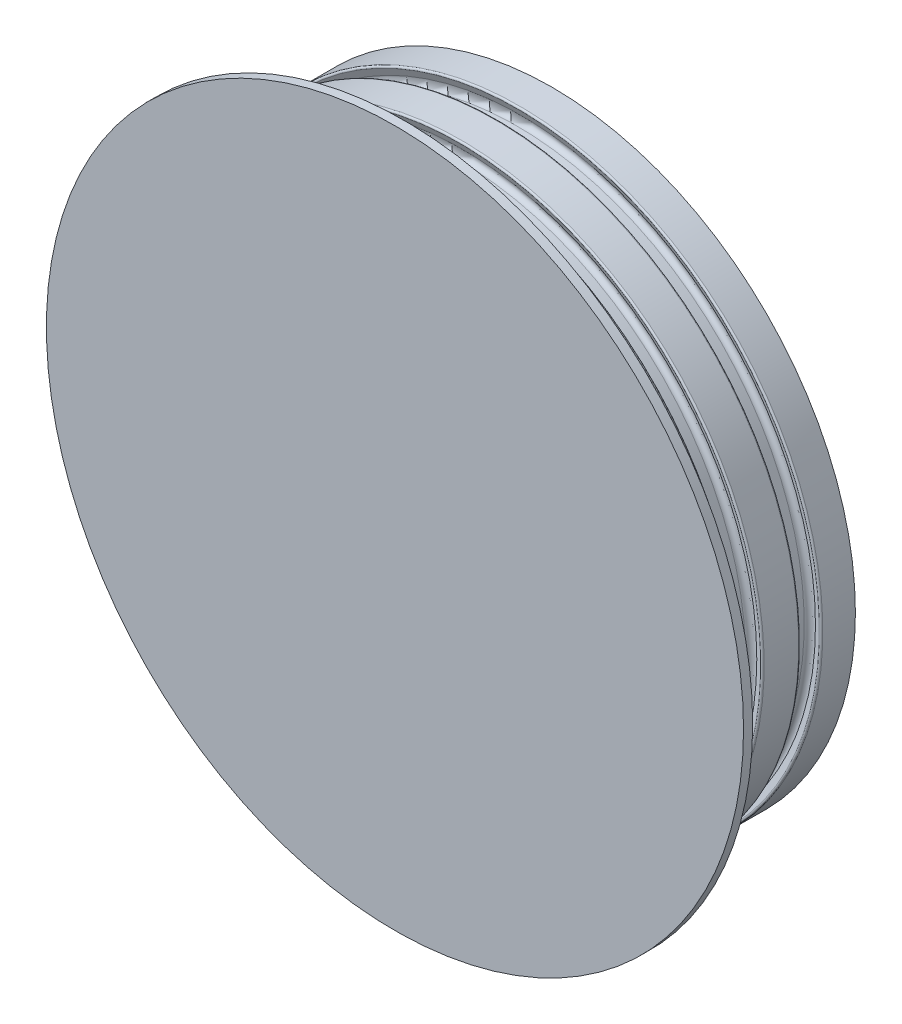
ISO-10303-21;
HEADER;
FILE_DESCRIPTION(('STEP AP214'),'2;1');
FILE_NAME('part.step','',(''),(''),'','','');
FILE_SCHEMA(('AUTOMOTIVE_DESIGN { 1 0 10303 214 1 1 1 1 }'));
ENDSEC;
DATA;
#1=APPLICATION_CONTEXT('core data for automotive mechanical design processes');
#2=APPLICATION_PROTOCOL_DEFINITION('international standard','automotive_design',2000,#1);
#3=PRODUCT_CONTEXT('',#1,'mechanical');
#4=PRODUCT('Part','Part','',(#3));
#5=PRODUCT_RELATED_PRODUCT_CATEGORY('part','',(#4));
#6=PRODUCT_DEFINITION_FORMATION('','',#4);
#7=PRODUCT_DEFINITION_CONTEXT('part definition',#1,'design');
#8=PRODUCT_DEFINITION('design','',#6,#7);
#9=PRODUCT_DEFINITION_SHAPE('','',#8);
#10=(LENGTH_UNIT() NAMED_UNIT(*) SI_UNIT(.MILLI.,.METRE.));
#11=(NAMED_UNIT(*) PLANE_ANGLE_UNIT() SI_UNIT($,.RADIAN.));
#12=(NAMED_UNIT(*) SI_UNIT($,.STERADIAN.) SOLID_ANGLE_UNIT());
#13=UNCERTAINTY_MEASURE_WITH_UNIT(LENGTH_MEASURE(1.E-05),#10,'distance_accuracy_value','');
#14=(GEOMETRIC_REPRESENTATION_CONTEXT(3) GLOBAL_UNCERTAINTY_ASSIGNED_CONTEXT((#13)) GLOBAL_UNIT_ASSIGNED_CONTEXT((#10,
#11,#12)) REPRESENTATION_CONTEXT('',''));
#15=CARTESIAN_POINT('',(0.,0.,0.));
#16=DIRECTION('',(0.,0.,1.));
#17=DIRECTION('',(1.,0.,0.));
#18=AXIS2_PLACEMENT_3D('',#15,#16,#17);
#19=CARTESIAN_POINT('',(0.,0.,77.1738238691624));
#20=DIRECTION('',(0.,0.,-1.));
#21=DIRECTION('',(-1.,0.,0.));
#22=AXIS2_PLACEMENT_3D('',#19,#20,#21);
#23=CYLINDRICAL_SURFACE('',#22,23.);
#24=CARTESIAN_POINT('',(0.,0.,0.));
#25=DIRECTION('',(0.,0.,-1.));
#26=DIRECTION('',(-1.,0.,0.));
#27=AXIS2_PLACEMENT_3D('',#24,#25,#26);
#28=CIRCLE('',#27,23.);
#29=CARTESIAN_POINT('',(-23.,0.,0.));
#30=VERTEX_POINT('',#29);
#31=EDGE_CURVE('E288',#30,#30,#28,.T.);
#32=ORIENTED_EDGE('',*,*,#31,.T.);
#33=EDGE_LOOP('',(#32));
#34=FACE_BOUND('',#33,.T.);
#35=DIRECTION('',(0.,0.,1.));
#36=VECTOR('',#35,1.);
#37=CARTESIAN_POINT('',(22.8992903820184,2.15,6.08887112585072));
#38=LINE('',#37,#36);
#39=CARTESIAN_POINT('',(22.8992903820184,2.15,10.12));
#40=VERTEX_POINT('',#39);
#41=CARTESIAN_POINT('',(22.8992903820184,2.15,12.12));
#42=VERTEX_POINT('',#41);
#43=EDGE_CURVE('E51',#40,#42,#38,.T.);
#44=ORIENTED_EDGE('',*,*,#43,.F.);
#45=CARTESIAN_POINT('',(0.,0.,10.12));
#46=DIRECTION('',(0.,0.,1.));
#47=DIRECTION('',(1.,0.,0.));
#48=AXIS2_PLACEMENT_3D('',#45,#46,#47);
#49=CIRCLE('',#48,23.);
#50=CARTESIAN_POINT('',(22.6224998618632,4.15,10.12));
#51=VERTEX_POINT('',#50);
#52=EDGE_CURVE('E55',#40,#51,#49,.T.);
#53=ORIENTED_EDGE('',*,*,#52,.T.);
#54=DIRECTION('',(0.,0.,1.));
#55=VECTOR('',#54,1.);
#56=CARTESIAN_POINT('',(22.6224998618632,4.15,6.08887112585072));
#57=LINE('',#56,#55);
#58=CARTESIAN_POINT('',(22.6224998618632,4.15,12.12));
#59=VERTEX_POINT('',#58);
#60=EDGE_CURVE('E174',#51,#59,#57,.T.);
#61=ORIENTED_EDGE('',*,*,#60,.T.);
#62=CARTESIAN_POINT('',(0.,0.,12.12));
#63=DIRECTION('',(0.,0.,1.));
#64=DIRECTION('',(1.,0.,0.));
#65=AXIS2_PLACEMENT_3D('',#62,#63,#64);
#66=CIRCLE('',#65,23.);
#67=CARTESIAN_POINT('',(21.9089023002066,6.99999999999999,12.12));
#68=VERTEX_POINT('',#67);
#69=EDGE_CURVE('E161',#68,#59,#66,.F.);
#70=ORIENTED_EDGE('',*,*,#69,.F.);
#71=DIRECTION('',(0.,0.,-1.));
#72=VECTOR('',#71,1.);
#73=CARTESIAN_POINT('',(21.9089023002066,6.99999999999999,34.9954850436765));
#74=LINE('',#73,#72);
#75=CARTESIAN_POINT('',(21.9089023002066,6.99999999999999,10.12));
#76=VERTEX_POINT('',#75);
#77=EDGE_CURVE('E284',#68,#76,#74,.T.);
#78=ORIENTED_EDGE('',*,*,#77,.T.);
#79=CARTESIAN_POINT('',(0.,0.,10.12));
#80=DIRECTION('',(0.,0.,1.));
#81=DIRECTION('',(1.,0.,0.));
#82=AXIS2_PLACEMENT_3D('',#79,#80,#81);
#83=CIRCLE('',#82,23.);
#84=CARTESIAN_POINT('',(21.9089023002066,-7.,10.12));
#85=VERTEX_POINT('',#84);
#86=EDGE_CURVE('E297',#85,#76,#83,.F.);
#87=ORIENTED_EDGE('',*,*,#86,.F.);
#88=DIRECTION('',(0.,0.,-1.));
#89=VECTOR('',#88,1.);
#90=CARTESIAN_POINT('',(21.9089023002066,-7.,34.9954850436765));
#91=LINE('',#90,#89);
#92=CARTESIAN_POINT('',(21.9089023002066,-7.,12.12));
#93=VERTEX_POINT('',#92);
#94=EDGE_CURVE('E289',#93,#85,#91,.T.);
#95=ORIENTED_EDGE('',*,*,#94,.F.);
#96=CARTESIAN_POINT('',(22.6224998618632,-4.15,12.12));
#97=VERTEX_POINT('',#96);
#98=EDGE_CURVE('E292',#97,#93,#66,.F.);
#99=ORIENTED_EDGE('',*,*,#98,.F.);
#100=DIRECTION('',(0.,0.,1.));
#101=VECTOR('',#100,1.);
#102=CARTESIAN_POINT('',(22.6224998618632,-4.15,6.08887112585072));
#103=LINE('',#102,#101);
#104=CARTESIAN_POINT('',(22.6224998618632,-4.15,10.12));
#105=VERTEX_POINT('',#104);
#106=EDGE_CURVE('E223',#105,#97,#103,.T.);
#107=ORIENTED_EDGE('',*,*,#106,.F.);
#108=CARTESIAN_POINT('',(0.,0.,10.12));
#109=DIRECTION('',(0.,0.,1.));
#110=DIRECTION('',(1.,0.,0.));
#111=AXIS2_PLACEMENT_3D('',#108,#109,#110);
#112=CIRCLE('',#111,23.);
#113=CARTESIAN_POINT('',(22.8992903820184,-2.15,10.12));
#114=VERTEX_POINT('',#113);
#115=EDGE_CURVE('E202',#105,#114,#112,.T.);
#116=ORIENTED_EDGE('',*,*,#115,.T.);
#117=DIRECTION('',(0.,0.,1.));
#118=VECTOR('',#117,1.);
#119=CARTESIAN_POINT('',(22.8992903820184,-2.15,6.08887112585072));
#120=LINE('',#119,#118);
#121=CARTESIAN_POINT('',(22.8992903820184,-2.15,12.12));
#122=VERTEX_POINT('',#121);
#123=EDGE_CURVE('E214',#114,#122,#120,.T.);
#124=ORIENTED_EDGE('',*,*,#123,.T.);
#125=EDGE_CURVE('E291',#42,#122,#66,.F.);
#126=ORIENTED_EDGE('',*,*,#125,.F.);
#127=EDGE_LOOP('',(#44,#53,#61,#70,#78,#87,#95,#99,#107,#116,#124,#126));
#128=FACE_BOUND('',#127,.T.);
#129=ADVANCED_FACE('F36',(#34,#128),#23,.F.);
#130=CARTESIAN_POINT('',(0.,0.,12.12));
#131=DIRECTION('',(0.,0.,1.));
#132=DIRECTION('',(1.,0.,0.));
#133=AXIS2_PLACEMENT_3D('',#130,#131,#132);
#134=PLANE('',#133);
#135=CARTESIAN_POINT('',(13.5814803603831,2.15,12.12));
#136=DIRECTION('',(0.,0.,1.));
#137=DIRECTION('',(1.,0.,0.));
#138=AXIS2_PLACEMENT_3D('',#135,#136,#137);
#139=CIRCLE('',#138,0.75);
#140=CARTESIAN_POINT('',(14.3314803603831,2.15,12.12));
#141=VERTEX_POINT('',#140);
#142=EDGE_CURVE('E12',#141,#141,#139,.F.);
#143=ORIENTED_EDGE('',*,*,#142,.F.);
#144=EDGE_LOOP('',(#143));
#145=FACE_BOUND('',#144,.T.);
#146=CARTESIAN_POINT('',(13.5814803603831,-2.15,12.12));
#147=DIRECTION('',(0.,0.,1.));
#148=DIRECTION('',(1.,0.,0.));
#149=AXIS2_PLACEMENT_3D('',#146,#147,#148);
#150=CIRCLE('',#149,0.75);
#151=CARTESIAN_POINT('',(14.3314803603831,-2.15,12.12));
#152=VERTEX_POINT('',#151);
#153=EDGE_CURVE('E44',#152,#152,#150,.F.);
#154=ORIENTED_EDGE('',*,*,#153,.F.);
#155=EDGE_LOOP('',(#154));
#156=FACE_BOUND('',#155,.T.);
#157=DIRECTION('',(-1.,0.,0.));
#158=VECTOR('',#157,1.);
#159=CARTESIAN_POINT('',(19.3992903820184,2.15,12.12));
#160=LINE('',#159,#158);
#161=CARTESIAN_POINT('',(19.3992903820184,2.15,12.12));
#162=VERTEX_POINT('',#161);
#163=EDGE_CURVE('E164',#42,#162,#160,.T.);
#164=ORIENTED_EDGE('',*,*,#163,.F.);
#165=ORIENTED_EDGE('',*,*,#125,.T.);
#166=DIRECTION('',(1.,0.,0.));
#167=VECTOR('',#166,1.);
#168=CARTESIAN_POINT('',(19.3992903820184,-2.15,12.12));
#169=LINE('',#168,#167);
#170=CARTESIAN_POINT('',(19.3992903820184,-2.15,12.12));
#171=VERTEX_POINT('',#170);
#172=EDGE_CURVE('E211',#171,#122,#169,.T.);
#173=ORIENTED_EDGE('',*,*,#172,.F.);
#174=DIRECTION('',(0.,1.,0.));
#175=VECTOR('',#174,1.);
#176=CARTESIAN_POINT('',(19.3992903820184,-4.15,12.12));
#177=LINE('',#176,#175);
#178=CARTESIAN_POINT('',(19.3992903820184,-4.15,12.12));
#179=VERTEX_POINT('',#178);
#180=EDGE_CURVE('E208',#179,#171,#177,.T.);
#181=ORIENTED_EDGE('',*,*,#180,.F.);
#182=DIRECTION('',(-1.,0.,0.));
#183=VECTOR('',#182,1.);
#184=CARTESIAN_POINT('',(22.6224998618632,-4.15,12.12));
#185=LINE('',#184,#183);
#186=EDGE_CURVE('E205',#97,#179,#185,.T.);
#187=ORIENTED_EDGE('',*,*,#186,.F.);
#188=ORIENTED_EDGE('',*,*,#98,.T.);
#189=DIRECTION('',(-1.,0.,0.));
#190=VECTOR('',#189,1.);
#191=CARTESIAN_POINT('',(21.9089023002066,-7.,12.12));
#192=LINE('',#191,#190);
#193=CARTESIAN_POINT('',(6.55261113046004,-7.,12.12));
#194=VERTEX_POINT('',#193);
#195=EDGE_CURVE('E285',#93,#194,#192,.T.);
#196=ORIENTED_EDGE('',*,*,#195,.T.);
#197=DIRECTION('',(0.,1.,0.));
#198=VECTOR('',#197,1.);
#199=CARTESIAN_POINT('',(6.55261113046003,0.,12.12));
#200=LINE('',#199,#198);
#201=CARTESIAN_POINT('',(6.55261113046004,7.,12.12));
#202=VERTEX_POINT('',#201);
#203=EDGE_CURVE('E362',#194,#202,#200,.T.);
#204=ORIENTED_EDGE('',*,*,#203,.T.);
#205=DIRECTION('',(1.,0.,0.));
#206=VECTOR('',#205,1.);
#207=CARTESIAN_POINT('',(21.9089023002066,7.,12.12));
#208=LINE('',#207,#206);
#209=EDGE_CURVE('E280',#202,#68,#208,.T.);
#210=ORIENTED_EDGE('',*,*,#209,.T.);
#211=ORIENTED_EDGE('',*,*,#69,.T.);
#212=DIRECTION('',(1.,0.,0.));
#213=VECTOR('',#212,1.);
#214=CARTESIAN_POINT('',(22.6224998618632,4.15,12.12));
#215=LINE('',#214,#213);
#216=CARTESIAN_POINT('',(19.3992903820184,4.15,12.12));
#217=VERTEX_POINT('',#216);
#218=EDGE_CURVE('E154',#217,#59,#215,.T.);
#219=ORIENTED_EDGE('',*,*,#218,.F.);
#220=DIRECTION('',(0.,1.,0.));
#221=VECTOR('',#220,1.);
#222=CARTESIAN_POINT('',(19.3992903820184,4.15,12.12));
#223=LINE('',#222,#221);
#224=EDGE_CURVE('E158',#162,#217,#223,.T.);
#225=ORIENTED_EDGE('',*,*,#224,.F.);
#226=EDGE_LOOP('',(#164,#165,#173,#181,#187,#188,#196,#204,#210,#211,#219,#225));
#227=FACE_BOUND('',#226,.T.);
#228=ADVANCED_FACE('F156',(#145,#156,#227),#134,.F.);
#229=CARTESIAN_POINT('',(0.,0.,10.12));
#230=DIRECTION('',(0.,0.,1.));
#231=DIRECTION('',(1.,0.,0.));
#232=AXIS2_PLACEMENT_3D('',#229,#230,#231);
#233=PLANE('',#232);
#234=DIRECTION('',(1.,0.,0.));
#235=VECTOR('',#234,1.);
#236=CARTESIAN_POINT('',(-5.,14.7403760248598,10.12));
#237=LINE('',#236,#235);
#238=CARTESIAN_POINT('',(-15.,14.7403760248598,10.12));
#239=VERTEX_POINT('',#238);
#240=CARTESIAN_POINT('',(-5.,14.7403760248598,10.12));
#241=VERTEX_POINT('',#240);
#242=EDGE_CURVE('E251',#239,#241,#237,.T.);
#243=ORIENTED_EDGE('',*,*,#242,.F.);
#244=DIRECTION('',(0.,1.,0.));
#245=VECTOR('',#244,1.);
#246=CARTESIAN_POINT('',(-15.,14.7403760248598,10.12));
#247=LINE('',#246,#245);
#248=CARTESIAN_POINT('',(-15.,-14.7403760248598,10.12));
#249=VERTEX_POINT('',#248);
#250=EDGE_CURVE('E204',#249,#239,#247,.T.);
#251=ORIENTED_EDGE('',*,*,#250,.F.);
#252=DIRECTION('',(-1.,0.,0.));
#253=VECTOR('',#252,1.);
#254=CARTESIAN_POINT('',(-5.,-14.7403760248598,10.12));
#255=LINE('',#254,#253);
#256=CARTESIAN_POINT('',(-5.,-14.7403760248598,10.12));
#257=VERTEX_POINT('',#256);
#258=EDGE_CURVE('E240',#257,#249,#255,.T.);
#259=ORIENTED_EDGE('',*,*,#258,.F.);
#260=DIRECTION('',(0.,-1.,0.));
#261=VECTOR('',#260,1.);
#262=CARTESIAN_POINT('',(-5.,14.7403760248598,10.12));
#263=LINE('',#262,#261);
#264=EDGE_CURVE('E254',#241,#257,#263,.T.);
#265=ORIENTED_EDGE('',*,*,#264,.F.);
#266=EDGE_LOOP('',(#243,#251,#259,#265));
#267=FACE_BOUND('',#266,.T.);
#268=CARTESIAN_POINT('',(11.6424908306669,-11.,10.12));
#269=DIRECTION('',(0.,0.,-1.));
#270=DIRECTION('',(1.,0.,0.));
#271=AXIS2_PLACEMENT_3D('',#268,#269,#270);
#272=CIRCLE('',#271,2.);
#273=CARTESIAN_POINT('',(13.6424908306669,-11.,10.12));
#274=VERTEX_POINT('',#273);
#275=EDGE_CURVE('E232',#274,#274,#272,.T.);
#276=ORIENTED_EDGE('',*,*,#275,.F.);
#277=EDGE_LOOP('',(#276));
#278=FACE_BOUND('',#277,.T.);
#279=CARTESIAN_POINT('',(11.6424908306669,11.,10.12));
#280=DIRECTION('',(0.,0.,-1.));
#281=DIRECTION('',(-1.,0.,0.));
#282=AXIS2_PLACEMENT_3D('',#279,#280,#281);
#283=CIRCLE('',#282,2.);
#284=CARTESIAN_POINT('',(9.64249083066692,11.,10.12));
#285=VERTEX_POINT('',#284);
#286=EDGE_CURVE('E231',#285,#285,#283,.T.);
#287=ORIENTED_EDGE('',*,*,#286,.F.);
#288=EDGE_LOOP('',(#287));
#289=FACE_BOUND('',#288,.T.);
#290=DIRECTION('',(1.,0.,0.));
#291=VECTOR('',#290,1.);
#292=CARTESIAN_POINT('',(21.9089023002066,7.,10.12));
#293=LINE('',#292,#291);
#294=CARTESIAN_POINT('',(2.08047517546045,7.,10.12));
#295=VERTEX_POINT('',#294);
#296=EDGE_CURVE('E275',#295,#76,#293,.T.);
#297=ORIENTED_EDGE('',*,*,#296,.F.);
#298=DIRECTION('',(0.,1.,0.));
#299=VECTOR('',#298,1.);
#300=CARTESIAN_POINT('',(2.08047517546045,0.,10.12));
#301=LINE('',#300,#299);
#302=CARTESIAN_POINT('',(2.08047517546045,-7.,10.12));
#303=VERTEX_POINT('',#302);
#304=EDGE_CURVE('E352',#295,#303,#301,.F.);
#305=ORIENTED_EDGE('',*,*,#304,.T.);
#306=DIRECTION('',(-1.,0.,0.));
#307=VECTOR('',#306,1.);
#308=CARTESIAN_POINT('',(21.9089023002066,-7.,10.12));
#309=LINE('',#308,#307);
#310=EDGE_CURVE('E278',#85,#303,#309,.T.);
#311=ORIENTED_EDGE('',*,*,#310,.F.);
#312=ORIENTED_EDGE('',*,*,#86,.T.);
#313=EDGE_LOOP('',(#297,#305,#311,#312));
#314=FACE_BOUND('',#313,.T.);
#315=ADVANCED_FACE('F376',(#267,#278,#289,#314),#233,.F.);
#316=CARTESIAN_POINT('',(0.,0.,12.12));
#317=DIRECTION('',(0.,0.,-1.));
#318=DIRECTION('',(-1.,0.,0.));
#319=AXIS2_PLACEMENT_3D('',#316,#317,#318);
#320=CYLINDRICAL_SURFACE('',#319,24.875);
#321=CARTESIAN_POINT('',(0.,0.,0.));
#322=DIRECTION('',(0.,0.,1.));
#323=DIRECTION('',(1.,0.,0.));
#324=AXIS2_PLACEMENT_3D('',#321,#322,#323);
#325=CIRCLE('',#324,24.875);
#326=CARTESIAN_POINT('',(24.875,0.,0.));
#327=VERTEX_POINT('',#326);
#328=EDGE_CURVE('E326',#327,#327,#325,.T.);
#329=ORIENTED_EDGE('',*,*,#328,.T.);
#330=EDGE_LOOP('',(#329));
#331=FACE_BOUND('',#330,.T.);
#332=CARTESIAN_POINT('',(0.,0.,2.668058361891));
#333=DIRECTION('',(0.,0.,-1.));
#334=DIRECTION('',(-1.,0.,0.));
#335=AXIS2_PLACEMENT_3D('',#332,#333,#334);
#336=CIRCLE('',#335,24.875);
#337=CARTESIAN_POINT('',(-24.875,0.,2.668058361891));
#338=VERTEX_POINT('',#337);
#339=EDGE_CURVE('E311',#338,#338,#336,.T.);
#340=ORIENTED_EDGE('',*,*,#339,.T.);
#341=EDGE_LOOP('',(#340));
#342=FACE_BOUND('',#341,.T.);
#343=ADVANCED_FACE('F384',(#331,#342),#320,.T.);
#344=CARTESIAN_POINT('',(0.,0.,0.));
#345=DIRECTION('',(0.,0.,1.));
#346=DIRECTION('',(1.,0.,0.));
#347=AXIS2_PLACEMENT_3D('',#344,#345,#346);
#348=PLANE('',#347);
#349=ORIENTED_EDGE('',*,*,#31,.F.);
#350=EDGE_LOOP('',(#349));
#351=FACE_BOUND('',#350,.T.);
#352=ORIENTED_EDGE('',*,*,#328,.F.);
#353=EDGE_LOOP('',(#352));
#354=FACE_BOUND('',#353,.T.);
#355=ADVANCED_FACE('F450',(#351,#354),#348,.F.);
#356=CARTESIAN_POINT('',(0.,0.,4.41248709063451));
#357=DIRECTION('',(0.,0.,-1.));
#358=DIRECTION('',(-1.,0.,0.));
#359=AXIS2_PLACEMENT_3D('',#356,#357,#358);
#360=TOROIDAL_SURFACE('',#359,23.973935,0.396875000000001);
#361=CARTESIAN_POINT('',(0.,0.,4.77505044413642));
#362=DIRECTION('',(0.,0.,-1.));
#363=DIRECTION('',(-1.,0.,0.));
#364=AXIS2_PLACEMENT_3D('',#361,#362,#363);
#365=CIRCLE('',#364,24.1353586052207);
#366=CARTESIAN_POINT('',(-24.1353586052207,0.,4.77505044413642));
#367=VERTEX_POINT('',#366);
#368=EDGE_CURVE('E301',#367,#367,#365,.T.);
#369=ORIENTED_EDGE('',*,*,#368,.T.);
#370=EDGE_LOOP('',(#369));
#371=FACE_BOUND('',#370,.T.);
#372=CARTESIAN_POINT('',(0.,0.,4.41248709063451));
#373=DIRECTION('',(0.,0.,-1.));
#374=DIRECTION('',(-1.,0.,0.));
#375=AXIS2_PLACEMENT_3D('',#372,#373,#374);
#376=CIRCLE('',#375,23.57706);
#377=CARTESIAN_POINT('',(-23.57706,0.,4.41248709063451));
#378=VERTEX_POINT('',#377);
#379=EDGE_CURVE('E323',#378,#378,#376,.T.);
#380=ORIENTED_EDGE('',*,*,#379,.F.);
#381=EDGE_LOOP('',(#380));
#382=FACE_BOUND('',#381,.T.);
#383=ADVANCED_FACE('F446',(#371,#382),#360,.F.);
#384=CARTESIAN_POINT('',(0.,0.,0.));
#385=DIRECTION('',(0.,0.,-1.));
#386=DIRECTION('',(-1.,0.,0.));
#387=AXIS2_PLACEMENT_3D('',#384,#385,#386);
#388=CYLINDRICAL_SURFACE('',#387,23.57706);
#389=ORIENTED_EDGE('',*,*,#379,.T.);
#390=EDGE_LOOP('',(#389));
#391=FACE_BOUND('',#390,.T.);
#392=CARTESIAN_POINT('',(0.,0.,2.896875));
#393=DIRECTION('',(0.,0.,-1.));
#394=DIRECTION('',(-1.,0.,0.));
#395=AXIS2_PLACEMENT_3D('',#392,#393,#394);
#396=CIRCLE('',#395,23.57706);
#397=CARTESIAN_POINT('',(-23.57706,0.,2.896875));
#398=VERTEX_POINT('',#397);
#399=EDGE_CURVE('E320',#398,#398,#396,.T.);
#400=ORIENTED_EDGE('',*,*,#399,.F.);
#401=EDGE_LOOP('',(#400));
#402=FACE_BOUND('',#401,.T.);
#403=ADVANCED_FACE('F442',(#391,#402),#388,.T.);
#404=CARTESIAN_POINT('',(0.,0.,2.896875));
#405=DIRECTION('',(0.,0.,-1.));
#406=DIRECTION('',(-1.,0.,0.));
#407=AXIS2_PLACEMENT_3D('',#404,#405,#406);
#408=TOROIDAL_SURFACE('',#407,23.973935,0.396875000000001);
#409=ORIENTED_EDGE('',*,*,#399,.T.);
#410=EDGE_LOOP('',(#409));
#411=FACE_BOUND('',#410,.T.);
#412=CARTESIAN_POINT('',(0.,0.,2.5343116464981));
#413=DIRECTION('',(0.,0.,-1.));
#414=DIRECTION('',(-1.,0.,0.));
#415=AXIS2_PLACEMENT_3D('',#412,#413,#414);
#416=CIRCLE('',#415,24.1353586052207);
#417=CARTESIAN_POINT('',(-24.1353586052207,0.,2.5343116464981));
#418=VERTEX_POINT('',#417);
#419=EDGE_CURVE('E317',#418,#418,#416,.T.);
#420=ORIENTED_EDGE('',*,*,#419,.F.);
#421=EDGE_LOOP('',(#420));
#422=FACE_BOUND('',#421,.T.);
#423=ADVANCED_FACE('F438',(#411,#422),#408,.F.);
#424=CARTESIAN_POINT('',(0.,0.,2.78407863501161));
#425=DIRECTION('',(0.,0.,1.));
#426=DIRECTION('',(1.,0.,0.));
#427=AXIS2_PLACEMENT_3D('',#424,#425,#426);
#428=CONICAL_SURFACE('',#427,24.6963444463294,1.15191730631625);
#429=ORIENTED_EDGE('',*,*,#419,.T.);
#430=EDGE_LOOP('',(#429));
#431=FACE_BOUND('',#430,.T.);
#432=CARTESIAN_POINT('',(0.,0.,2.78407863501161));
#433=DIRECTION('',(0.,0.,-1.));
#434=DIRECTION('',(-1.,0.,0.));
#435=AXIS2_PLACEMENT_3D('',#432,#433,#434);
#436=CIRCLE('',#435,24.6963444463294);
#437=CARTESIAN_POINT('',(-24.6963444463294,0.,2.78407863501161));
#438=VERTEX_POINT('',#437);
#439=EDGE_CURVE('E314',#438,#438,#436,.T.);
#440=ORIENTED_EDGE('',*,*,#439,.F.);
#441=EDGE_LOOP('',(#440));
#442=FACE_BOUND('',#441,.T.);
#443=ADVANCED_FACE('F434',(#431,#442),#428,.F.);
#444=CARTESIAN_POINT('',(0.,0.,2.668058361891));
#445=DIRECTION('',(0.,0.,-1.));
#446=DIRECTION('',(-1.,0.,0.));
#447=AXIS2_PLACEMENT_3D('',#444,#445,#446);
#448=TOROIDAL_SURFACE('',#447,24.748,0.126999999999999);
#449=ORIENTED_EDGE('',*,*,#439,.T.);
#450=EDGE_LOOP('',(#449));
#451=FACE_BOUND('',#450,.T.);
#452=ORIENTED_EDGE('',*,*,#339,.F.);
#453=EDGE_LOOP('',(#452));
#454=FACE_BOUND('',#453,.T.);
#455=ADVANCED_FACE('F430',(#451,#454),#448,.T.);
#456=CARTESIAN_POINT('',(0.,0.,4.64130372874351));
#457=DIRECTION('',(0.,0.,-1.));
#458=DIRECTION('',(-1.,0.,0.));
#459=AXIS2_PLACEMENT_3D('',#456,#457,#458);
#460=TOROIDAL_SURFACE('',#459,24.748,0.126999999999999);
#461=CARTESIAN_POINT('',(0.,0.,4.64130372874351));
#462=DIRECTION('',(0.,0.,-1.));
#463=DIRECTION('',(-1.,0.,0.));
#464=AXIS2_PLACEMENT_3D('',#461,#462,#463);
#465=CIRCLE('',#464,24.875);
#466=CARTESIAN_POINT('',(-24.875,0.,4.64130372874351));
#467=VERTEX_POINT('',#466);
#468=EDGE_CURVE('E308',#467,#467,#465,.T.);
#469=ORIENTED_EDGE('',*,*,#468,.T.);
#470=EDGE_LOOP('',(#469));
#471=FACE_BOUND('',#470,.T.);
#472=CARTESIAN_POINT('',(0.,0.,4.5252834556229));
#473=DIRECTION('',(0.,0.,-1.));
#474=DIRECTION('',(-1.,0.,0.));
#475=AXIS2_PLACEMENT_3D('',#472,#473,#474);
#476=CIRCLE('',#475,24.6963444463294);
#477=CARTESIAN_POINT('',(-24.6963444463294,0.,4.5252834556229));
#478=VERTEX_POINT('',#477);
#479=EDGE_CURVE('E304',#478,#478,#476,.T.);
#480=ORIENTED_EDGE('',*,*,#479,.F.);
#481=EDGE_LOOP('',(#480));
#482=FACE_BOUND('',#481,.T.);
#483=ADVANCED_FACE('F426',(#471,#482),#460,.T.);
#484=CARTESIAN_POINT('',(0.,0.,4.77505044413642));
#485=DIRECTION('',(0.,0.,-1.));
#486=DIRECTION('',(-1.,0.,0.));
#487=AXIS2_PLACEMENT_3D('',#484,#485,#486);
#488=CONICAL_SURFACE('',#487,24.1353586052207,1.15191730631625);
#489=ORIENTED_EDGE('',*,*,#479,.T.);
#490=EDGE_LOOP('',(#489));
#491=FACE_BOUND('',#490,.T.);
#492=ORIENTED_EDGE('',*,*,#368,.F.);
#493=EDGE_LOOP('',(#492));
#494=FACE_BOUND('',#493,.T.);
#495=ADVANCED_FACE('F422',(#491,#494),#488,.F.);
#496=ORIENTED_EDGE('',*,*,#468,.F.);
#497=EDGE_LOOP('',(#496));
#498=FACE_BOUND('',#497,.T.);
#499=CARTESIAN_POINT('',(0.,0.,7.47742045252551));
#500=DIRECTION('',(0.,0.,-1.));
#501=DIRECTION('',(-1.,0.,0.));
#502=AXIS2_PLACEMENT_3D('',#499,#500,#501);
#503=CIRCLE('',#502,24.875);
#504=CARTESIAN_POINT('',(-24.875,0.,7.47742045252551));
#505=VERTEX_POINT('',#504);
#506=EDGE_CURVE('E329',#505,#505,#503,.T.);
#507=ORIENTED_EDGE('',*,*,#506,.T.);
#508=EDGE_LOOP('',(#507));
#509=FACE_BOUND('',#508,.T.);
#510=ADVANCED_FACE('F425',(#498,#509),#320,.T.);
#511=CARTESIAN_POINT('',(0.,0.,9.45066581937802));
#512=DIRECTION('',(0.,0.,-1.));
#513=DIRECTION('',(-1.,0.,0.));
#514=AXIS2_PLACEMENT_3D('',#511,#512,#513);
#515=TOROIDAL_SURFACE('',#514,24.748,0.126999999999999);
#516=CARTESIAN_POINT('',(0.,0.,9.45066581937802));
#517=DIRECTION('',(0.,0.,-1.));
#518=DIRECTION('',(-1.,0.,0.));
#519=AXIS2_PLACEMENT_3D('',#516,#517,#518);
#520=CIRCLE('',#519,24.875);
#521=CARTESIAN_POINT('',(-24.875,0.,9.45066581937802));
#522=VERTEX_POINT('',#521);
#523=EDGE_CURVE('E300',#522,#522,#520,.T.);
#524=ORIENTED_EDGE('',*,*,#523,.T.);
#525=EDGE_LOOP('',(#524));
#526=FACE_BOUND('',#525,.T.);
#527=CARTESIAN_POINT('',(0.,0.,9.33464554625741));
#528=DIRECTION('',(0.,0.,-1.));
#529=DIRECTION('',(-1.,0.,0.));
#530=AXIS2_PLACEMENT_3D('',#527,#528,#529);
#531=CIRCLE('',#530,24.6963444463294);
#532=CARTESIAN_POINT('',(-24.6963444463294,0.,9.33464554625741));
#533=VERTEX_POINT('',#532);
#534=EDGE_CURVE('E305',#533,#533,#531,.T.);
#535=ORIENTED_EDGE('',*,*,#534,.F.);
#536=EDGE_LOOP('',(#535));
#537=FACE_BOUND('',#536,.T.);
#538=ADVANCED_FACE('F475',(#526,#537),#515,.T.);
#539=CARTESIAN_POINT('',(0.,0.,9.58441253477093));
#540=DIRECTION('',(0.,0.,-1.));
#541=DIRECTION('',(-1.,0.,0.));
#542=AXIS2_PLACEMENT_3D('',#539,#540,#541);
#543=CONICAL_SURFACE('',#542,24.1353586052207,1.15191730631625);
#544=ORIENTED_EDGE('',*,*,#534,.T.);
#545=EDGE_LOOP('',(#544));
#546=FACE_BOUND('',#545,.T.);
#547=CARTESIAN_POINT('',(0.,0.,9.58441253477093));
#548=DIRECTION('',(0.,0.,-1.));
#549=DIRECTION('',(-1.,0.,0.));
#550=AXIS2_PLACEMENT_3D('',#547,#548,#549);
#551=CIRCLE('',#550,24.1353586052207);
#552=CARTESIAN_POINT('',(-24.1353586052207,0.,9.58441253477093));
#553=VERTEX_POINT('',#552);
#554=EDGE_CURVE('E344',#553,#553,#551,.T.);
#555=ORIENTED_EDGE('',*,*,#554,.F.);
#556=EDGE_LOOP('',(#555));
#557=FACE_BOUND('',#556,.T.);
#558=ADVANCED_FACE('F471',(#546,#557),#543,.F.);
#559=CARTESIAN_POINT('',(0.,0.,9.22184918126903));
#560=DIRECTION('',(0.,0.,-1.));
#561=DIRECTION('',(-1.,0.,0.));
#562=AXIS2_PLACEMENT_3D('',#559,#560,#561);
#563=TOROIDAL_SURFACE('',#562,23.973935,0.396875000000001);
#564=ORIENTED_EDGE('',*,*,#554,.T.);
#565=EDGE_LOOP('',(#564));
#566=FACE_BOUND('',#565,.T.);
#567=CARTESIAN_POINT('',(0.,0.,9.22184918126903));
#568=DIRECTION('',(0.,0.,-1.));
#569=DIRECTION('',(-1.,0.,0.));
#570=AXIS2_PLACEMENT_3D('',#567,#568,#569);
#571=CIRCLE('',#570,23.57706);
#572=CARTESIAN_POINT('',(-23.57706,0.,9.22184918126903));
#573=VERTEX_POINT('',#572);
#574=EDGE_CURVE('E341',#573,#573,#571,.T.);
#575=ORIENTED_EDGE('',*,*,#574,.F.);
#576=EDGE_LOOP('',(#575));
#577=FACE_BOUND('',#576,.T.);
#578=ADVANCED_FACE('F467',(#566,#577),#563,.F.);
#579=CARTESIAN_POINT('',(0.,0.,0.));
#580=DIRECTION('',(0.,0.,-1.));
#581=DIRECTION('',(-1.,0.,0.));
#582=AXIS2_PLACEMENT_3D('',#579,#580,#581);
#583=CYLINDRICAL_SURFACE('',#582,23.57706);
#584=ORIENTED_EDGE('',*,*,#574,.T.);
#585=EDGE_LOOP('',(#584));
#586=FACE_BOUND('',#585,.T.);
#587=CARTESIAN_POINT('',(0.,0.,7.70623709063451));
#588=DIRECTION('',(0.,0.,-1.));
#589=DIRECTION('',(-1.,0.,0.));
#590=AXIS2_PLACEMENT_3D('',#587,#588,#589);
#591=CIRCLE('',#590,23.57706);
#592=CARTESIAN_POINT('',(-23.57706,0.,7.70623709063451));
#593=VERTEX_POINT('',#592);
#594=EDGE_CURVE('E338',#593,#593,#591,.T.);
#595=ORIENTED_EDGE('',*,*,#594,.F.);
#596=EDGE_LOOP('',(#595));
#597=FACE_BOUND('',#596,.T.);
#598=ADVANCED_FACE('F463',(#586,#597),#583,.T.);
#599=CARTESIAN_POINT('',(0.,0.,7.70623709063451));
#600=DIRECTION('',(0.,0.,-1.));
#601=DIRECTION('',(-1.,0.,0.));
#602=AXIS2_PLACEMENT_3D('',#599,#600,#601);
#603=TOROIDAL_SURFACE('',#602,23.973935,0.396875000000001);
#604=ORIENTED_EDGE('',*,*,#594,.T.);
#605=EDGE_LOOP('',(#604));
#606=FACE_BOUND('',#605,.T.);
#607=CARTESIAN_POINT('',(0.,0.,7.34367373713261));
#608=DIRECTION('',(0.,0.,-1.));
#609=DIRECTION('',(-1.,0.,0.));
#610=AXIS2_PLACEMENT_3D('',#607,#608,#609);
#611=CIRCLE('',#610,24.1353586052207);
#612=CARTESIAN_POINT('',(-24.1353586052207,0.,7.34367373713261));
#613=VERTEX_POINT('',#612);
#614=EDGE_CURVE('E335',#613,#613,#611,.T.);
#615=ORIENTED_EDGE('',*,*,#614,.F.);
#616=EDGE_LOOP('',(#615));
#617=FACE_BOUND('',#616,.T.);
#618=ADVANCED_FACE('F459',(#606,#617),#603,.F.);
#619=CARTESIAN_POINT('',(0.,0.,7.59344072564612));
#620=DIRECTION('',(0.,0.,1.));
#621=DIRECTION('',(1.,0.,0.));
#622=AXIS2_PLACEMENT_3D('',#619,#620,#621);
#623=CONICAL_SURFACE('',#622,24.6963444463294,1.15191730631625);
#624=ORIENTED_EDGE('',*,*,#614,.T.);
#625=EDGE_LOOP('',(#624));
#626=FACE_BOUND('',#625,.T.);
#627=CARTESIAN_POINT('',(0.,0.,7.59344072564612));
#628=DIRECTION('',(0.,0.,-1.));
#629=DIRECTION('',(-1.,0.,0.));
#630=AXIS2_PLACEMENT_3D('',#627,#628,#629);
#631=CIRCLE('',#630,24.6963444463294);
#632=CARTESIAN_POINT('',(-24.6963444463294,0.,7.59344072564612));
#633=VERTEX_POINT('',#632);
#634=EDGE_CURVE('E332',#633,#633,#631,.T.);
#635=ORIENTED_EDGE('',*,*,#634,.F.);
#636=EDGE_LOOP('',(#635));
#637=FACE_BOUND('',#636,.T.);
#638=ADVANCED_FACE('F455',(#626,#637),#623,.F.);
#639=CARTESIAN_POINT('',(0.,0.,7.47742045252551));
#640=DIRECTION('',(0.,0.,-1.));
#641=DIRECTION('',(-1.,0.,0.));
#642=AXIS2_PLACEMENT_3D('',#639,#640,#641);
#643=TOROIDAL_SURFACE('',#642,24.748,0.126999999999999);
#644=ORIENTED_EDGE('',*,*,#634,.T.);
#645=EDGE_LOOP('',(#644));
#646=FACE_BOUND('',#645,.T.);
#647=ORIENTED_EDGE('',*,*,#506,.F.);
#648=EDGE_LOOP('',(#647));
#649=FACE_BOUND('',#648,.T.);
#650=ADVANCED_FACE('F452',(#646,#649),#643,.T.);
#651=ORIENTED_EDGE('',*,*,#523,.F.);
#652=EDGE_LOOP('',(#651));
#653=FACE_BOUND('',#652,.T.);
#654=CARTESIAN_POINT('',(0.,0.,12.12));
#655=DIRECTION('',(0.,0.,1.));
#656=DIRECTION('',(1.,0.,0.));
#657=AXIS2_PLACEMENT_3D('',#654,#655,#656);
#658=CIRCLE('',#657,24.875);
#659=CARTESIAN_POINT('',(24.875,0.,12.12));
#660=VERTEX_POINT('',#659);
#661=EDGE_CURVE('E349',#660,#660,#658,.T.);
#662=ORIENTED_EDGE('',*,*,#661,.F.);
#663=EDGE_LOOP('',(#662));
#664=FACE_BOUND('',#663,.T.);
#665=ADVANCED_FACE('F419',(#653,#664),#320,.T.);
#666=CARTESIAN_POINT('',(21.9089023002066,7.,34.9954850436765));
#667=DIRECTION('',(0.,1.,0.));
#668=DIRECTION('',(0.,0.,1.));
#669=AXIS2_PLACEMENT_3D('',#666,#667,#668);
#670=PLANE('',#669);
#671=ORIENTED_EDGE('',*,*,#209,.F.);
#672=CARTESIAN_POINT('',(6.55261113046003,7.,9.12));
#673=DIRECTION('',(0.,1.,0.));
#674=DIRECTION('',(0.,0.,1.));
#675=AXIS2_PLACEMENT_3D('',#672,#673,#674);
#676=CIRCLE('',#675,3.);
#677=CARTESIAN_POINT('',(4.31654315296024,7.,11.12));
#678=VERTEX_POINT('',#677);
#679=EDGE_CURVE('E365',#202,#678,#676,.F.);
#680=ORIENTED_EDGE('',*,*,#679,.T.);
#681=CARTESIAN_POINT('',(2.08047517546045,7.,13.12));
#682=DIRECTION('',(0.,1.,0.));
#683=DIRECTION('',(0.,0.,1.));
#684=AXIS2_PLACEMENT_3D('',#681,#682,#683);
#685=CIRCLE('',#684,3.);
#686=EDGE_CURVE('E357',#678,#295,#685,.T.);
#687=ORIENTED_EDGE('',*,*,#686,.T.);
#688=ORIENTED_EDGE('',*,*,#296,.T.);
#689=ORIENTED_EDGE('',*,*,#77,.F.);
#690=EDGE_LOOP('',(#671,#680,#687,#688,#689));
#691=FACE_BOUND('',#690,.T.);
#692=ADVANCED_FACE('F402',(#691),#670,.F.);
#693=CARTESIAN_POINT('',(21.9089023002066,-7.,34.9954850436765));
#694=DIRECTION('',(0.,-1.,0.));
#695=DIRECTION('',(0.,0.,-1.));
#696=AXIS2_PLACEMENT_3D('',#693,#694,#695);
#697=PLANE('',#696);
#698=CARTESIAN_POINT('',(2.08047517546045,-7.,13.12));
#699=DIRECTION('',(0.,-1.,0.));
#700=DIRECTION('',(0.,0.,-1.));
#701=AXIS2_PLACEMENT_3D('',#698,#699,#700);
#702=CIRCLE('',#701,3.);
#703=CARTESIAN_POINT('',(4.31654315296024,-7.,11.12));
#704=VERTEX_POINT('',#703);
#705=EDGE_CURVE('E359',#303,#704,#702,.T.);
#706=ORIENTED_EDGE('',*,*,#705,.T.);
#707=CARTESIAN_POINT('',(6.55261113046003,-7.,9.12));
#708=DIRECTION('',(0.,-1.,0.));
#709=DIRECTION('',(0.,0.,-1.));
#710=AXIS2_PLACEMENT_3D('',#707,#708,#709);
#711=CIRCLE('',#710,3.);
#712=EDGE_CURVE('E369',#704,#194,#711,.F.);
#713=ORIENTED_EDGE('',*,*,#712,.T.);
#714=ORIENTED_EDGE('',*,*,#195,.F.);
#715=ORIENTED_EDGE('',*,*,#94,.T.);
#716=ORIENTED_EDGE('',*,*,#310,.T.);
#717=EDGE_LOOP('',(#706,#713,#714,#715,#716));
#718=FACE_BOUND('',#717,.T.);
#719=ADVANCED_FACE('F394',(#718),#697,.F.);
#720=ORIENTED_EDGE('',*,*,#661,.T.);
#721=EDGE_LOOP('',(#720));
#722=FACE_BOUND('',#721,.T.);
#723=CARTESIAN_POINT('',(0.,0.,12.12));
#724=DIRECTION('',(0.,0.,1.));
#725=DIRECTION('',(1.,0.,0.));
#726=AXIS2_PLACEMENT_3D('',#723,#724,#725);
#727=CIRCLE('',#726,28.575);
#728=CARTESIAN_POINT('',(28.575,0.,12.12));
#729=VERTEX_POINT('',#728);
#730=EDGE_CURVE('E269',#729,#729,#727,.T.);
#731=ORIENTED_EDGE('',*,*,#730,.F.);
#732=EDGE_LOOP('',(#731));
#733=FACE_BOUND('',#732,.T.);
#734=ADVANCED_FACE('F379',(#722,#733),#134,.F.);
#735=CARTESIAN_POINT('',(0.,0.,12.87));
#736=DIRECTION('',(0.,0.,1.));
#737=DIRECTION('',(1.,0.,0.));
#738=AXIS2_PLACEMENT_3D('',#735,#736,#737);
#739=PLANE('',#738);
#740=CARTESIAN_POINT('',(0.,0.,12.87));
#741=DIRECTION('',(0.,0.,1.));
#742=DIRECTION('',(1.,0.,0.));
#743=AXIS2_PLACEMENT_3D('',#740,#741,#742);
#744=CIRCLE('',#743,28.575);
#745=CARTESIAN_POINT('',(28.575,0.,12.87));
#746=VERTEX_POINT('',#745);
#747=EDGE_CURVE('E272',#746,#746,#744,.T.);
#748=ORIENTED_EDGE('',*,*,#747,.T.);
#749=EDGE_LOOP('',(#748));
#750=FACE_BOUND('',#749,.T.);
#751=ADVANCED_FACE('F393',(#750),#739,.T.);
#752=CARTESIAN_POINT('',(0.,0.,12.87));
#753=DIRECTION('',(0.,0.,-1.));
#754=DIRECTION('',(-1.,0.,0.));
#755=AXIS2_PLACEMENT_3D('',#752,#753,#754);
#756=CYLINDRICAL_SURFACE('',#755,28.575);
#757=ORIENTED_EDGE('',*,*,#747,.F.);
#758=EDGE_LOOP('',(#757));
#759=FACE_BOUND('',#758,.T.);
#760=ORIENTED_EDGE('',*,*,#730,.T.);
#761=EDGE_LOOP('',(#760));
#762=FACE_BOUND('',#761,.T.);
#763=ADVANCED_FACE('F400',(#759,#762),#756,.T.);
#764=CARTESIAN_POINT('',(2.08047517546045,7.,13.12));
#765=DIRECTION('',(0.,1.,0.));
#766=DIRECTION('',(0.,0.,1.));
#767=AXIS2_PLACEMENT_3D('',#764,#765,#766);
#768=CYLINDRICAL_SURFACE('',#767,3.);
#769=ORIENTED_EDGE('',*,*,#686,.F.);
#770=DIRECTION('',(0.,1.,0.));
#771=VECTOR('',#770,1.);
#772=CARTESIAN_POINT('',(4.31654315296024,7.,11.12));
#773=LINE('',#772,#771);
#774=EDGE_CURVE('E367',#678,#704,#773,.F.);
#775=ORIENTED_EDGE('',*,*,#774,.T.);
#776=ORIENTED_EDGE('',*,*,#705,.F.);
#777=ORIENTED_EDGE('',*,*,#304,.F.);
#778=EDGE_LOOP('',(#769,#775,#776,#777));
#779=FACE_BOUND('',#778,.T.);
#780=ADVANCED_FACE('F410',(#779),#768,.T.);
#781=CARTESIAN_POINT('',(6.55261113046003,7.,9.12));
#782=DIRECTION('',(0.,1.,0.));
#783=DIRECTION('',(0.,0.,1.));
#784=AXIS2_PLACEMENT_3D('',#781,#782,#783);
#785=CYLINDRICAL_SURFACE('',#784,3.);
#786=ORIENTED_EDGE('',*,*,#712,.F.);
#787=ORIENTED_EDGE('',*,*,#774,.F.);
#788=ORIENTED_EDGE('',*,*,#679,.F.);
#789=ORIENTED_EDGE('',*,*,#203,.F.);
#790=EDGE_LOOP('',(#786,#787,#788,#789));
#791=FACE_BOUND('',#790,.T.);
#792=ADVANCED_FACE('F38',(#791),#785,.F.);
#793=CARTESIAN_POINT('',(11.6424908306669,11.,10.62));
#794=DIRECTION('',(0.,0.,-1.));
#795=DIRECTION('',(-1.,0.,0.));
#796=AXIS2_PLACEMENT_3D('',#793,#794,#795);
#797=CYLINDRICAL_SURFACE('',#796,2.);
#798=CARTESIAN_POINT('',(11.6424908306669,11.,10.62));
#799=DIRECTION('',(0.,0.,-1.));
#800=DIRECTION('',(-1.,0.,0.));
#801=AXIS2_PLACEMENT_3D('',#798,#799,#800);
#802=CIRCLE('',#801,2.);
#803=CARTESIAN_POINT('',(9.64249083066692,11.,10.62));
#804=VERTEX_POINT('',#803);
#805=EDGE_CURVE('E266',#804,#804,#802,.T.);
#806=ORIENTED_EDGE('',*,*,#805,.F.);
#807=EDGE_LOOP('',(#806));
#808=FACE_BOUND('',#807,.T.);
#809=ORIENTED_EDGE('',*,*,#286,.T.);
#810=EDGE_LOOP('',(#809));
#811=FACE_BOUND('',#810,.T.);
#812=ADVANCED_FACE('F596',(#808,#811),#797,.F.);
#813=CARTESIAN_POINT('',(11.6424908306669,11.,10.62));
#814=DIRECTION('',(0.,0.,-1.));
#815=DIRECTION('',(-1.,0.,0.));
#816=AXIS2_PLACEMENT_3D('',#813,#814,#815);
#817=PLANE('',#816);
#818=ORIENTED_EDGE('',*,*,#805,.T.);
#819=EDGE_LOOP('',(#818));
#820=FACE_BOUND('',#819,.T.);
#821=ADVANCED_FACE('F610',(#820),#817,.T.);
#822=CARTESIAN_POINT('',(11.6424908306669,-11.,10.62));
#823=DIRECTION('',(0.,0.,-1.));
#824=DIRECTION('',(-1.,0.,0.));
#825=AXIS2_PLACEMENT_3D('',#822,#823,#824);
#826=CYLINDRICAL_SURFACE('',#825,2.);
#827=CARTESIAN_POINT('',(11.6424908306669,-11.,10.62));
#828=DIRECTION('',(0.,0.,-1.));
#829=DIRECTION('',(1.,0.,0.));
#830=AXIS2_PLACEMENT_3D('',#827,#828,#829);
#831=CIRCLE('',#830,2.);
#832=CARTESIAN_POINT('',(13.6424908306669,-11.,10.62));
#833=VERTEX_POINT('',#832);
#834=EDGE_CURVE('E228',#833,#833,#831,.T.);
#835=ORIENTED_EDGE('',*,*,#834,.F.);
#836=EDGE_LOOP('',(#835));
#837=FACE_BOUND('',#836,.T.);
#838=ORIENTED_EDGE('',*,*,#275,.T.);
#839=EDGE_LOOP('',(#838));
#840=FACE_BOUND('',#839,.T.);
#841=ADVANCED_FACE('F620',(#837,#840),#826,.F.);
#842=CARTESIAN_POINT('',(11.6424908306669,-11.,10.62));
#843=DIRECTION('',(0.,0.,1.));
#844=DIRECTION('',(1.,0.,0.));
#845=AXIS2_PLACEMENT_3D('',#842,#843,#844);
#846=PLANE('',#845);
#847=ORIENTED_EDGE('',*,*,#834,.T.);
#848=EDGE_LOOP('',(#847));
#849=FACE_BOUND('',#848,.T.);
#850=ADVANCED_FACE('F630',(#849),#846,.F.);
#851=CARTESIAN_POINT('',(-15.,14.7403760248598,10.62));
#852=DIRECTION('',(-1.,0.,0.));
#853=DIRECTION('',(0.,-1.,0.));
#854=AXIS2_PLACEMENT_3D('',#851,#852,#853);
#855=PLANE('',#854);
#856=ORIENTED_EDGE('',*,*,#250,.T.);
#857=DIRECTION('',(0.,0.,-1.));
#858=VECTOR('',#857,1.);
#859=CARTESIAN_POINT('',(-15.,14.7403760248598,10.62));
#860=LINE('',#859,#858);
#861=CARTESIAN_POINT('',(-15.,14.7403760248598,10.62));
#862=VERTEX_POINT('',#861);
#863=EDGE_CURVE('E249',#862,#239,#860,.T.);
#864=ORIENTED_EDGE('',*,*,#863,.F.);
#865=DIRECTION('',(0.,1.,0.));
#866=VECTOR('',#865,1.);
#867=CARTESIAN_POINT('',(-15.,14.7403760248598,10.62));
#868=LINE('',#867,#866);
#869=CARTESIAN_POINT('',(-15.,-14.7403760248598,10.62));
#870=VERTEX_POINT('',#869);
#871=EDGE_CURVE('E236',#870,#862,#868,.T.);
#872=ORIENTED_EDGE('',*,*,#871,.F.);
#873=DIRECTION('',(0.,0.,-1.));
#874=VECTOR('',#873,1.);
#875=CARTESIAN_POINT('',(-15.,-14.7403760248598,10.62));
#876=LINE('',#875,#874);
#877=EDGE_CURVE('E235',#870,#249,#876,.T.);
#878=ORIENTED_EDGE('',*,*,#877,.T.);
#879=EDGE_LOOP('',(#856,#864,#872,#878));
#880=FACE_BOUND('',#879,.T.);
#881=ADVANCED_FACE('F640',(#880),#855,.F.);
#882=CARTESIAN_POINT('',(-5.,-14.7403760248598,10.62));
#883=DIRECTION('',(0.,-1.,0.));
#884=DIRECTION('',(0.,0.,-1.));
#885=AXIS2_PLACEMENT_3D('',#882,#883,#884);
#886=PLANE('',#885);
#887=ORIENTED_EDGE('',*,*,#258,.T.);
#888=ORIENTED_EDGE('',*,*,#877,.F.);
#889=DIRECTION('',(-1.,0.,0.));
#890=VECTOR('',#889,1.);
#891=CARTESIAN_POINT('',(-5.,-14.7403760248598,10.62));
#892=LINE('',#891,#890);
#893=CARTESIAN_POINT('',(-5.,-14.7403760248598,10.62));
#894=VERTEX_POINT('',#893);
#895=EDGE_CURVE('E246',#894,#870,#892,.T.);
#896=ORIENTED_EDGE('',*,*,#895,.F.);
#897=DIRECTION('',(0.,0.,-1.));
#898=VECTOR('',#897,1.);
#899=CARTESIAN_POINT('',(-5.,-14.7403760248598,10.62));
#900=LINE('',#899,#898);
#901=EDGE_CURVE('E260',#894,#257,#900,.T.);
#902=ORIENTED_EDGE('',*,*,#901,.T.);
#903=EDGE_LOOP('',(#887,#888,#896,#902));
#904=FACE_BOUND('',#903,.T.);
#905=ADVANCED_FACE('F650',(#904),#886,.F.);
#906=CARTESIAN_POINT('',(-5.,14.7403760248598,10.62));
#907=DIRECTION('',(1.,0.,0.));
#908=DIRECTION('',(0.,1.,0.));
#909=AXIS2_PLACEMENT_3D('',#906,#907,#908);
#910=PLANE('',#909);
#911=ORIENTED_EDGE('',*,*,#264,.T.);
#912=ORIENTED_EDGE('',*,*,#901,.F.);
#913=DIRECTION('',(0.,-1.,0.));
#914=VECTOR('',#913,1.);
#915=CARTESIAN_POINT('',(-5.,14.7403760248598,10.62));
#916=LINE('',#915,#914);
#917=CARTESIAN_POINT('',(-5.,14.7403760248598,10.62));
#918=VERTEX_POINT('',#917);
#919=EDGE_CURVE('E243',#918,#894,#916,.T.);
#920=ORIENTED_EDGE('',*,*,#919,.F.);
#921=DIRECTION('',(0.,0.,-1.));
#922=VECTOR('',#921,1.);
#923=CARTESIAN_POINT('',(-5.,14.7403760248598,10.62));
#924=LINE('',#923,#922);
#925=EDGE_CURVE('E262',#918,#241,#924,.T.);
#926=ORIENTED_EDGE('',*,*,#925,.T.);
#927=EDGE_LOOP('',(#911,#912,#920,#926));
#928=FACE_BOUND('',#927,.T.);
#929=ADVANCED_FACE('F660',(#928),#910,.F.);
#930=CARTESIAN_POINT('',(-5.,14.7403760248598,10.62));
#931=DIRECTION('',(0.,1.,0.));
#932=DIRECTION('',(0.,0.,1.));
#933=AXIS2_PLACEMENT_3D('',#930,#931,#932);
#934=PLANE('',#933);
#935=ORIENTED_EDGE('',*,*,#242,.T.);
#936=ORIENTED_EDGE('',*,*,#925,.F.);
#937=DIRECTION('',(1.,0.,0.));
#938=VECTOR('',#937,1.);
#939=CARTESIAN_POINT('',(-5.,14.7403760248598,10.62));
#940=LINE('',#939,#938);
#941=EDGE_CURVE('E239',#862,#918,#940,.T.);
#942=ORIENTED_EDGE('',*,*,#941,.F.);
#943=ORIENTED_EDGE('',*,*,#863,.T.);
#944=EDGE_LOOP('',(#935,#936,#942,#943));
#945=FACE_BOUND('',#944,.T.);
#946=ADVANCED_FACE('F670',(#945),#934,.F.);
#947=CARTESIAN_POINT('',(0.,0.,10.62));
#948=DIRECTION('',(0.,0.,-1.));
#949=DIRECTION('',(-1.,0.,0.));
#950=AXIS2_PLACEMENT_3D('',#947,#948,#949);
#951=PLANE('',#950);
#952=ORIENTED_EDGE('',*,*,#871,.T.);
#953=ORIENTED_EDGE('',*,*,#941,.T.);
#954=ORIENTED_EDGE('',*,*,#919,.T.);
#955=ORIENTED_EDGE('',*,*,#895,.T.);
#956=EDGE_LOOP('',(#952,#953,#954,#955));
#957=FACE_BOUND('',#956,.T.);
#958=ADVANCED_FACE('F680',(#957),#951,.T.);
#959=CARTESIAN_POINT('',(19.3992903820184,-2.15,6.08887112585072));
#960=DIRECTION('',(0.,-1.,0.));
#961=DIRECTION('',(1.,0.,0.));
#962=AXIS2_PLACEMENT_3D('',#959,#960,#961);
#963=PLANE('',#962);
#964=ORIENTED_EDGE('',*,*,#123,.F.);
#965=DIRECTION('',(-1.,0.,0.));
#966=VECTOR('',#965,1.);
#967=CARTESIAN_POINT('',(19.3992903820184,-2.15,10.12));
#968=LINE('',#967,#966);
#969=CARTESIAN_POINT('',(19.3992903820184,-2.15,10.12));
#970=VERTEX_POINT('',#969);
#971=EDGE_CURVE('E199',#114,#970,#968,.T.);
#972=ORIENTED_EDGE('',*,*,#971,.T.);
#973=DIRECTION('',(0.,0.,1.));
#974=VECTOR('',#973,1.);
#975=CARTESIAN_POINT('',(19.3992903820184,-2.15,6.08887112585072));
#976=LINE('',#975,#974);
#977=EDGE_CURVE('E217',#970,#171,#976,.T.);
#978=ORIENTED_EDGE('',*,*,#977,.T.);
#979=ORIENTED_EDGE('',*,*,#172,.T.);
#980=EDGE_LOOP('',(#964,#972,#978,#979));
#981=FACE_BOUND('',#980,.T.);
#982=ADVANCED_FACE('F690',(#981),#963,.F.);
#983=CARTESIAN_POINT('',(19.3992903820184,-4.15,6.08887112585072));
#984=DIRECTION('',(1.,0.,0.));
#985=DIRECTION('',(0.,0.,-1.));
#986=AXIS2_PLACEMENT_3D('',#983,#984,#985);
#987=PLANE('',#986);
#988=ORIENTED_EDGE('',*,*,#977,.F.);
#989=DIRECTION('',(0.,-1.,0.));
#990=VECTOR('',#989,1.);
#991=CARTESIAN_POINT('',(19.3992903820184,-4.15,10.12));
#992=LINE('',#991,#990);
#993=CARTESIAN_POINT('',(19.3992903820184,-4.15,10.12));
#994=VERTEX_POINT('',#993);
#995=EDGE_CURVE('E195',#970,#994,#992,.T.);
#996=ORIENTED_EDGE('',*,*,#995,.T.);
#997=DIRECTION('',(0.,0.,1.));
#998=VECTOR('',#997,1.);
#999=CARTESIAN_POINT('',(19.3992903820184,-4.15,6.08887112585072));
#1000=LINE('',#999,#998);
#1001=EDGE_CURVE('E220',#994,#179,#1000,.T.);
#1002=ORIENTED_EDGE('',*,*,#1001,.T.);
#1003=ORIENTED_EDGE('',*,*,#180,.T.);
#1004=EDGE_LOOP('',(#988,#996,#1002,#1003));
#1005=FACE_BOUND('',#1004,.T.);
#1006=ADVANCED_FACE('F711',(#1005),#987,.F.);
#1007=CARTESIAN_POINT('',(22.6224998618632,-4.15,6.08887112585072));
#1008=DIRECTION('',(0.,1.,0.));
#1009=DIRECTION('',(0.,0.,1.));
#1010=AXIS2_PLACEMENT_3D('',#1007,#1008,#1009);
#1011=PLANE('',#1010);
#1012=ORIENTED_EDGE('',*,*,#1001,.F.);
#1013=DIRECTION('',(1.,0.,0.));
#1014=VECTOR('',#1013,1.);
#1015=CARTESIAN_POINT('',(22.6224998618632,-4.15,10.12));
#1016=LINE('',#1015,#1014);
#1017=EDGE_CURVE('E198',#994,#105,#1016,.T.);
#1018=ORIENTED_EDGE('',*,*,#1017,.T.);
#1019=ORIENTED_EDGE('',*,*,#106,.T.);
#1020=ORIENTED_EDGE('',*,*,#186,.T.);
#1021=EDGE_LOOP('',(#1012,#1018,#1019,#1020));
#1022=FACE_BOUND('',#1021,.T.);
#1023=ADVANCED_FACE('F721',(#1022),#1011,.F.);
#1024=CARTESIAN_POINT('',(0.,0.,10.12));
#1025=DIRECTION('',(0.,0.,1.));
#1026=DIRECTION('',(1.,0.,0.));
#1027=AXIS2_PLACEMENT_3D('',#1024,#1025,#1026);
#1028=PLANE('',#1027);
#1029=ORIENTED_EDGE('',*,*,#1017,.F.);
#1030=ORIENTED_EDGE('',*,*,#995,.F.);
#1031=ORIENTED_EDGE('',*,*,#971,.F.);
#1032=ORIENTED_EDGE('',*,*,#115,.F.);
#1033=EDGE_LOOP('',(#1029,#1030,#1031,#1032));
#1034=FACE_BOUND('',#1033,.T.);
#1035=ADVANCED_FACE('F731',(#1034),#1028,.F.);
#1036=CARTESIAN_POINT('',(19.3992903820184,2.15,6.08887112585072));
#1037=DIRECTION('',(0.,1.,0.));
#1038=DIRECTION('',(-1.,0.,0.));
#1039=AXIS2_PLACEMENT_3D('',#1036,#1037,#1038);
#1040=PLANE('',#1039);
#1041=DIRECTION('',(0.,0.,1.));
#1042=VECTOR('',#1041,1.);
#1043=CARTESIAN_POINT('',(19.3992903820184,2.15,6.08887112585072));
#1044=LINE('',#1043,#1042);
#1045=CARTESIAN_POINT('',(19.3992903820184,2.15,10.12));
#1046=VERTEX_POINT('',#1045);
#1047=EDGE_CURVE('E178',#1046,#162,#1044,.T.);
#1048=ORIENTED_EDGE('',*,*,#1047,.F.);
#1049=DIRECTION('',(1.,0.,0.));
#1050=VECTOR('',#1049,1.);
#1051=CARTESIAN_POINT('',(19.3992903820184,2.15,10.12));
#1052=LINE('',#1051,#1050);
#1053=EDGE_CURVE('E173',#1046,#40,#1052,.T.);
#1054=ORIENTED_EDGE('',*,*,#1053,.T.);
#1055=ORIENTED_EDGE('',*,*,#43,.T.);
#1056=ORIENTED_EDGE('',*,*,#163,.T.);
#1057=EDGE_LOOP('',(#1048,#1054,#1055,#1056));
#1058=FACE_BOUND('',#1057,.T.);
#1059=ADVANCED_FACE('F741',(#1058),#1040,.F.);
#1060=CARTESIAN_POINT('',(22.6224998618632,4.15,6.08887112585072));
#1061=DIRECTION('',(0.,-1.,0.));
#1062=DIRECTION('',(0.,0.,-1.));
#1063=AXIS2_PLACEMENT_3D('',#1060,#1061,#1062);
#1064=PLANE('',#1063);
#1065=ORIENTED_EDGE('',*,*,#60,.F.);
#1066=DIRECTION('',(-1.,0.,0.));
#1067=VECTOR('',#1066,1.);
#1068=CARTESIAN_POINT('',(22.6224998618632,4.15,10.12));
#1069=LINE('',#1068,#1067);
#1070=CARTESIAN_POINT('',(19.3992903820184,4.15,10.12));
#1071=VERTEX_POINT('',#1070);
#1072=EDGE_CURVE('E170',#51,#1071,#1069,.T.);
#1073=ORIENTED_EDGE('',*,*,#1072,.T.);
#1074=DIRECTION('',(0.,0.,1.));
#1075=VECTOR('',#1074,1.);
#1076=CARTESIAN_POINT('',(19.3992903820184,4.15,6.08887112585072));
#1077=LINE('',#1076,#1075);
#1078=EDGE_CURVE('E168',#1071,#217,#1077,.T.);
#1079=ORIENTED_EDGE('',*,*,#1078,.T.);
#1080=ORIENTED_EDGE('',*,*,#218,.T.);
#1081=EDGE_LOOP('',(#1065,#1073,#1079,#1080));
#1082=FACE_BOUND('',#1081,.T.);
#1083=ADVANCED_FACE('F169',(#1082),#1064,.F.);
#1084=CARTESIAN_POINT('',(19.3992903820184,4.15,6.08887112585072));
#1085=DIRECTION('',(1.,0.,0.));
#1086=DIRECTION('',(0.,0.,-1.));
#1087=AXIS2_PLACEMENT_3D('',#1084,#1085,#1086);
#1088=PLANE('',#1087);
#1089=ORIENTED_EDGE('',*,*,#1078,.F.);
#1090=DIRECTION('',(0.,-1.,0.));
#1091=VECTOR('',#1090,1.);
#1092=CARTESIAN_POINT('',(19.3992903820184,4.15,10.12));
#1093=LINE('',#1092,#1091);
#1094=EDGE_CURVE('E186',#1071,#1046,#1093,.T.);
#1095=ORIENTED_EDGE('',*,*,#1094,.T.);
#1096=ORIENTED_EDGE('',*,*,#1047,.T.);
#1097=ORIENTED_EDGE('',*,*,#224,.T.);
#1098=EDGE_LOOP('',(#1089,#1095,#1096,#1097));
#1099=FACE_BOUND('',#1098,.T.);
#1100=ADVANCED_FACE('F176',(#1099),#1088,.F.);
#1101=CARTESIAN_POINT('',(0.,0.,10.12));
#1102=DIRECTION('',(0.,0.,1.));
#1103=DIRECTION('',(1.,0.,0.));
#1104=AXIS2_PLACEMENT_3D('',#1101,#1102,#1103);
#1105=PLANE('',#1104);
#1106=ORIENTED_EDGE('',*,*,#1072,.F.);
#1107=ORIENTED_EDGE('',*,*,#52,.F.);
#1108=ORIENTED_EDGE('',*,*,#1053,.F.);
#1109=ORIENTED_EDGE('',*,*,#1094,.F.);
#1110=EDGE_LOOP('',(#1106,#1107,#1108,#1109));
#1111=FACE_BOUND('',#1110,.T.);
#1112=ADVANCED_FACE('F768',(#1111),#1105,.F.);
#1113=CARTESIAN_POINT('',(13.5814803603831,-2.15,6.08887112585072));
#1114=DIRECTION('',(0.,0.,1.));
#1115=DIRECTION('',(1.,0.,0.));
#1116=AXIS2_PLACEMENT_3D('',#1113,#1114,#1115);
#1117=CYLINDRICAL_SURFACE('',#1116,0.75);
#1118=CARTESIAN_POINT('',(13.5814803603831,-2.15,10.12));
#1119=DIRECTION('',(0.,0.,1.));
#1120=DIRECTION('',(1.,0.,0.));
#1121=AXIS2_PLACEMENT_3D('',#1118,#1119,#1120);
#1122=CIRCLE('',#1121,0.75);
#1123=CARTESIAN_POINT('',(14.3314803603831,-2.15,10.12));
#1124=VERTEX_POINT('',#1123);
#1125=EDGE_CURVE('E180',#1124,#1124,#1122,.T.);
#1126=ORIENTED_EDGE('',*,*,#1125,.T.);
#1127=EDGE_LOOP('',(#1126));
#1128=FACE_BOUND('',#1127,.T.);
#1129=ORIENTED_EDGE('',*,*,#153,.T.);
#1130=EDGE_LOOP('',(#1129));
#1131=FACE_BOUND('',#1130,.T.);
#1132=ADVANCED_FACE('F373',(#1128,#1131),#1117,.T.);
#1133=CARTESIAN_POINT('',(0.,0.,10.12));
#1134=DIRECTION('',(0.,0.,1.));
#1135=DIRECTION('',(1.,0.,0.));
#1136=AXIS2_PLACEMENT_3D('',#1133,#1134,#1135);
#1137=PLANE('',#1136);
#1138=ORIENTED_EDGE('',*,*,#1125,.F.);
#1139=EDGE_LOOP('',(#1138));
#1140=FACE_BOUND('',#1139,.T.);
#1141=ADVANCED_FACE('F786',(#1140),#1137,.F.);
#1142=CARTESIAN_POINT('',(13.5814803603831,2.15,6.08887112585072));
#1143=DIRECTION('',(0.,0.,1.));
#1144=DIRECTION('',(1.,0.,0.));
#1145=AXIS2_PLACEMENT_3D('',#1142,#1143,#1144);
#1146=CYLINDRICAL_SURFACE('',#1145,0.75);
#1147=CARTESIAN_POINT('',(13.5814803603831,2.15,10.12));
#1148=DIRECTION('',(0.,0.,1.));
#1149=DIRECTION('',(1.,0.,0.));
#1150=AXIS2_PLACEMENT_3D('',#1147,#1148,#1149);
#1151=CIRCLE('',#1150,0.75);
#1152=CARTESIAN_POINT('',(14.3314803603831,2.15,10.12));
#1153=VERTEX_POINT('',#1152);
#1154=EDGE_CURVE('E183',#1153,#1153,#1151,.T.);
#1155=ORIENTED_EDGE('',*,*,#1154,.T.);
#1156=EDGE_LOOP('',(#1155));
#1157=FACE_BOUND('',#1156,.T.);
#1158=ORIENTED_EDGE('',*,*,#142,.T.);
#1159=EDGE_LOOP('',(#1158));
#1160=FACE_BOUND('',#1159,.T.);
#1161=ADVANCED_FACE('F796',(#1157,#1160),#1146,.T.);
#1162=CARTESIAN_POINT('',(0.,0.,10.12));
#1163=DIRECTION('',(0.,0.,1.));
#1164=DIRECTION('',(1.,0.,0.));
#1165=AXIS2_PLACEMENT_3D('',#1162,#1163,#1164);
#1166=PLANE('',#1165);
#1167=ORIENTED_EDGE('',*,*,#1154,.F.);
#1168=EDGE_LOOP('',(#1167));
#1169=FACE_BOUND('',#1168,.T.);
#1170=ADVANCED_FACE('F806',(#1169),#1166,.F.);
#1171=CLOSED_SHELL('',(#129,#228,#315,#343,#355,#383,#403,#423,#443,#455,#483,#495,#510,#538,
#558,#578,#598,#618,#638,#650,#665,#692,#719,#734,#751,#763,#780,#792,#812,#821,#841,#850,#881,
#905,#929,#946,#958,#982,#1006,#1023,#1035,#1059,#1083,#1100,#1112,#1132,#1141,#1161,#1170));
#1172=MANIFOLD_SOLID_BREP('B2',#1171);
#1173=ADVANCED_BREP_SHAPE_REPRESENTATION('',(#18,#1172),#14);
#1174=SHAPE_DEFINITION_REPRESENTATION(#9,#1173);
ENDSEC;
END-ISO-10303-21;
